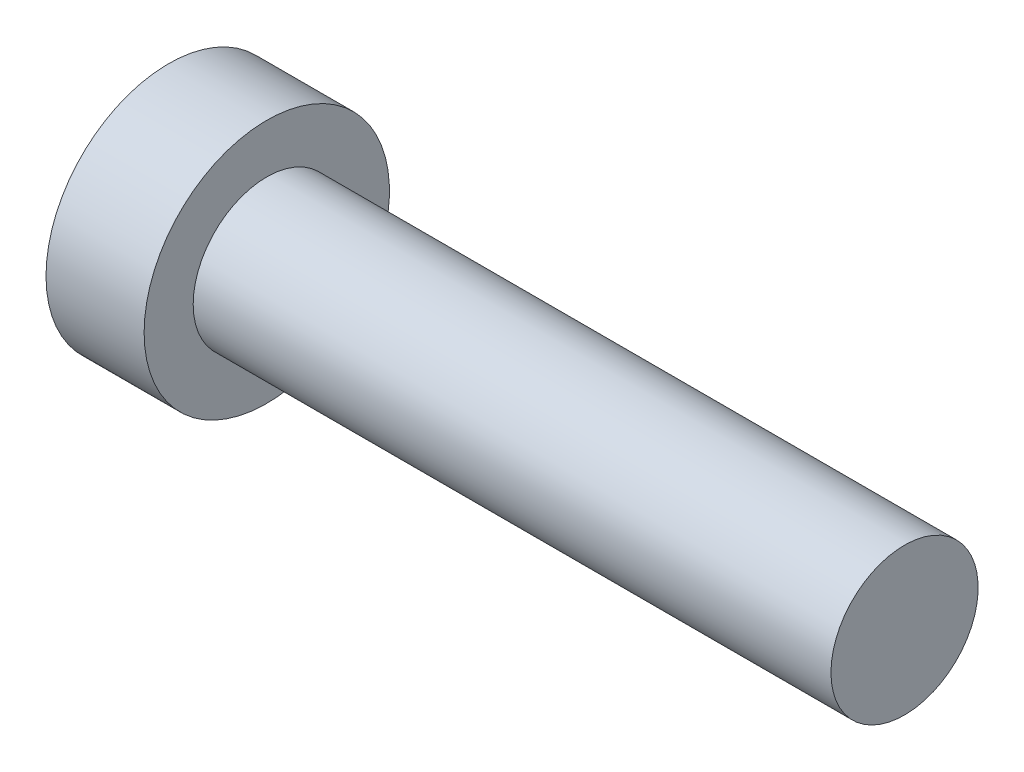
ISO-10303-21;
HEADER;
FILE_DESCRIPTION(('STEP AP214'),'2;1');
FILE_NAME('part.step','',(''),(''),'','','');
FILE_SCHEMA(('AUTOMOTIVE_DESIGN { 1 0 10303 214 1 1 1 1 }'));
ENDSEC;
DATA;
#1=APPLICATION_CONTEXT('core data for automotive mechanical design processes');
#2=APPLICATION_PROTOCOL_DEFINITION('international standard','automotive_design',2000,#1);
#3=PRODUCT_CONTEXT('',#1,'mechanical');
#4=PRODUCT('Part','Part','',(#3));
#5=PRODUCT_RELATED_PRODUCT_CATEGORY('part','',(#4));
#6=PRODUCT_DEFINITION_FORMATION('','',#4);
#7=PRODUCT_DEFINITION_CONTEXT('part definition',#1,'design');
#8=PRODUCT_DEFINITION('design','',#6,#7);
#9=PRODUCT_DEFINITION_SHAPE('','',#8);
#10=(LENGTH_UNIT() NAMED_UNIT(*) SI_UNIT(.MILLI.,.METRE.));
#11=(NAMED_UNIT(*) PLANE_ANGLE_UNIT() SI_UNIT($,.RADIAN.));
#12=(NAMED_UNIT(*) SI_UNIT($,.STERADIAN.) SOLID_ANGLE_UNIT());
#13=UNCERTAINTY_MEASURE_WITH_UNIT(LENGTH_MEASURE(1.E-05),#10,'distance_accuracy_value','');
#14=(GEOMETRIC_REPRESENTATION_CONTEXT(3) GLOBAL_UNCERTAINTY_ASSIGNED_CONTEXT((#13)) GLOBAL_UNIT_ASSIGNED_CONTEXT((#10,
#11,#12)) REPRESENTATION_CONTEXT('',''));
#15=CARTESIAN_POINT('',(0.,0.,0.));
#16=DIRECTION('',(0.,0.,1.));
#17=DIRECTION('',(1.,0.,0.));
#18=AXIS2_PLACEMENT_3D('',#15,#16,#17);
#19=CARTESIAN_POINT('',(0.,5.,0.));
#20=DIRECTION('',(1.,0.,0.));
#21=DIRECTION('',(0.,0.,-1.));
#22=AXIS2_PLACEMENT_3D('',#19,#20,#21);
#23=PLANE('',#22);
#24=DIRECTION('',(0.,0.866025403784439,-0.5));
#25=VECTOR('',#24,1.);
#26=CARTESIAN_POINT('',(0.,0.,2.88675134594813));
#27=LINE('',#26,#25);
#28=CARTESIAN_POINT('',(0.,0.,2.88675134594813));
#29=VERTEX_POINT('',#28);
#30=CARTESIAN_POINT('',(0.,2.5,1.44337567297406));
#31=VERTEX_POINT('',#30);
#32=EDGE_CURVE('E123',#29,#31,#27,.T.);
#33=ORIENTED_EDGE('',*,*,#32,.F.);
#34=DIRECTION('',(0.,0.866025403784439,0.5));
#35=VECTOR('',#34,1.);
#36=CARTESIAN_POINT('',(0.,-2.5,1.44337567297406));
#37=LINE('',#36,#35);
#38=CARTESIAN_POINT('',(0.,-2.5,1.44337567297406));
#39=VERTEX_POINT('',#38);
#40=EDGE_CURVE('E49',#39,#29,#37,.T.);
#41=ORIENTED_EDGE('',*,*,#40,.F.);
#42=DIRECTION('',(0.,0.,1.));
#43=VECTOR('',#42,1.);
#44=CARTESIAN_POINT('',(0.,-2.5,-1.44337567297406));
#45=LINE('',#44,#43);
#46=CARTESIAN_POINT('',(0.,-2.5,-1.44337567297406));
#47=VERTEX_POINT('',#46);
#48=EDGE_CURVE('E132',#47,#39,#45,.T.);
#49=ORIENTED_EDGE('',*,*,#48,.F.);
#50=DIRECTION('',(0.,-0.866025403784439,0.5));
#51=VECTOR('',#50,1.);
#52=CARTESIAN_POINT('',(0.,0.,-2.88675134594813));
#53=LINE('',#52,#51);
#54=CARTESIAN_POINT('',(0.,0.,-2.88675134594813));
#55=VERTEX_POINT('',#54);
#56=EDGE_CURVE('E130',#55,#47,#53,.T.);
#57=ORIENTED_EDGE('',*,*,#56,.F.);
#58=DIRECTION('',(0.,-0.866025403784439,-0.5));
#59=VECTOR('',#58,1.);
#60=CARTESIAN_POINT('',(0.,2.5,-1.44337567297407));
#61=LINE('',#60,#59);
#62=CARTESIAN_POINT('',(0.,2.5,-1.44337567297407));
#63=VERTEX_POINT('',#62);
#64=EDGE_CURVE('E97',#63,#55,#61,.T.);
#65=ORIENTED_EDGE('',*,*,#64,.F.);
#66=DIRECTION('',(0.,0.,-1.));
#67=VECTOR('',#66,1.);
#68=CARTESIAN_POINT('',(0.,2.5,1.44337567297406));
#69=LINE('',#68,#67);
#70=EDGE_CURVE('E126',#31,#63,#69,.T.);
#71=ORIENTED_EDGE('',*,*,#70,.F.);
#72=EDGE_LOOP('',(#33,#41,#49,#57,#65,#71));
#73=FACE_BOUND('',#72,.T.);
#74=CARTESIAN_POINT('',(0.,0.,0.));
#75=DIRECTION('',(-1.,0.,0.));
#76=DIRECTION('',(0.,0.,1.));
#77=AXIS2_PLACEMENT_3D('',#74,#75,#76);
#78=CIRCLE('',#77,5.);
#79=CARTESIAN_POINT('',(0.,0.,5.));
#80=VERTEX_POINT('',#79);
#81=EDGE_CURVE('E136',#80,#80,#78,.T.);
#82=ORIENTED_EDGE('',*,*,#81,.T.);
#83=EDGE_LOOP('',(#82));
#84=FACE_BOUND('',#83,.T.);
#85=ADVANCED_FACE('F35',(#73,#84),#23,.F.);
#86=CARTESIAN_POINT('',(30.,0.,0.));
#87=DIRECTION('',(-1.,0.,0.));
#88=DIRECTION('',(0.,0.,1.));
#89=AXIS2_PLACEMENT_3D('',#86,#87,#88);
#90=PLANE('',#89);
#91=CARTESIAN_POINT('',(30.,0.,0.));
#92=DIRECTION('',(-1.,0.,0.));
#93=DIRECTION('',(0.,0.,1.));
#94=AXIS2_PLACEMENT_3D('',#91,#92,#93);
#95=CIRCLE('',#94,3.);
#96=CARTESIAN_POINT('',(30.,0.,3.));
#97=VERTEX_POINT('',#96);
#98=EDGE_CURVE('E11',#97,#97,#95,.T.);
#99=ORIENTED_EDGE('',*,*,#98,.F.);
#100=EDGE_LOOP('',(#99));
#101=FACE_BOUND('',#100,.T.);
#102=ADVANCED_FACE('F154',(#101),#90,.F.);
#103=CARTESIAN_POINT('',(0.,0.,0.));
#104=DIRECTION('',(-1.,0.,0.));
#105=DIRECTION('',(0.,0.,1.));
#106=AXIS2_PLACEMENT_3D('',#103,#104,#105);
#107=CYLINDRICAL_SURFACE('',#106,3.);
#108=CARTESIAN_POINT('',(4.,0.,0.));
#109=DIRECTION('',(-1.,0.,0.));
#110=DIRECTION('',(0.,0.,1.));
#111=AXIS2_PLACEMENT_3D('',#108,#109,#110);
#112=CIRCLE('',#111,3.);
#113=CARTESIAN_POINT('',(4.,0.,3.));
#114=VERTEX_POINT('',#113);
#115=EDGE_CURVE('E42',#114,#114,#112,.T.);
#116=ORIENTED_EDGE('',*,*,#115,.F.);
#117=EDGE_LOOP('',(#116));
#118=FACE_BOUND('',#117,.T.);
#119=ORIENTED_EDGE('',*,*,#98,.T.);
#120=EDGE_LOOP('',(#119));
#121=FACE_BOUND('',#120,.T.);
#122=ADVANCED_FACE('F151',(#118,#121),#107,.T.);
#123=CARTESIAN_POINT('',(4.,3.,0.));
#124=DIRECTION('',(-1.,0.,0.));
#125=DIRECTION('',(0.,0.,1.));
#126=AXIS2_PLACEMENT_3D('',#123,#124,#125);
#127=PLANE('',#126);
#128=CARTESIAN_POINT('',(4.,0.,0.));
#129=DIRECTION('',(-1.,0.,0.));
#130=DIRECTION('',(0.,0.,1.));
#131=AXIS2_PLACEMENT_3D('',#128,#129,#130);
#132=CIRCLE('',#131,5.);
#133=CARTESIAN_POINT('',(4.,0.,5.));
#134=VERTEX_POINT('',#133);
#135=EDGE_CURVE('E144',#134,#134,#132,.T.);
#136=ORIENTED_EDGE('',*,*,#135,.F.);
#137=EDGE_LOOP('',(#136));
#138=FACE_BOUND('',#137,.T.);
#139=ORIENTED_EDGE('',*,*,#115,.T.);
#140=EDGE_LOOP('',(#139));
#141=FACE_BOUND('',#140,.T.);
#142=ADVANCED_FACE('F149',(#138,#141),#127,.F.);
#143=CARTESIAN_POINT('',(0.,0.,0.));
#144=DIRECTION('',(-1.,0.,0.));
#145=DIRECTION('',(0.,0.,1.));
#146=AXIS2_PLACEMENT_3D('',#143,#144,#145);
#147=CYLINDRICAL_SURFACE('',#146,5.);
#148=ORIENTED_EDGE('',*,*,#81,.F.);
#149=EDGE_LOOP('',(#148));
#150=FACE_BOUND('',#149,.T.);
#151=ORIENTED_EDGE('',*,*,#135,.T.);
#152=EDGE_LOOP('',(#151));
#153=FACE_BOUND('',#152,.T.);
#154=ADVANCED_FACE('F166',(#150,#153),#147,.T.);
#155=CARTESIAN_POINT('',(2.38,-2.5,1.44337567297406));
#156=DIRECTION('',(0.,-0.5,0.866025403784439));
#157=DIRECTION('',(0.,-0.866025403784439,-0.5));
#158=AXIS2_PLACEMENT_3D('',#155,#156,#157);
#159=PLANE('',#158);
#160=ORIENTED_EDGE('',*,*,#40,.T.);
#161=DIRECTION('',(-1.,0.,0.));
#162=VECTOR('',#161,1.);
#163=CARTESIAN_POINT('',(2.38,0.,2.88675134594813));
#164=LINE('',#163,#162);
#165=CARTESIAN_POINT('',(2.38,0.,2.88675134594813));
#166=VERTEX_POINT('',#165);
#167=EDGE_CURVE('E79',#166,#29,#164,.T.);
#168=ORIENTED_EDGE('',*,*,#167,.F.);
#169=DIRECTION('',(0.,0.866025403784439,0.5));
#170=VECTOR('',#169,1.);
#171=CARTESIAN_POINT('',(2.38,-2.5,1.44337567297406));
#172=LINE('',#171,#170);
#173=CARTESIAN_POINT('',(2.38,-2.5,1.44337567297406));
#174=VERTEX_POINT('',#173);
#175=EDGE_CURVE('E134',#174,#166,#172,.T.);
#176=ORIENTED_EDGE('',*,*,#175,.F.);
#177=DIRECTION('',(-1.,0.,0.));
#178=VECTOR('',#177,1.);
#179=CARTESIAN_POINT('',(2.38,-2.5,1.44337567297406));
#180=LINE('',#179,#178);
#181=EDGE_CURVE('E57',#174,#39,#180,.T.);
#182=ORIENTED_EDGE('',*,*,#181,.T.);
#183=EDGE_LOOP('',(#160,#168,#176,#182));
#184=FACE_BOUND('',#183,.T.);
#185=ADVANCED_FACE('F170',(#184),#159,.F.);
#186=CARTESIAN_POINT('',(2.38,-2.5,-1.44337567297406));
#187=DIRECTION('',(0.,-1.,0.));
#188=DIRECTION('',(0.,0.,-1.));
#189=AXIS2_PLACEMENT_3D('',#186,#187,#188);
#190=PLANE('',#189);
#191=ORIENTED_EDGE('',*,*,#48,.T.);
#192=ORIENTED_EDGE('',*,*,#181,.F.);
#193=DIRECTION('',(0.,0.,1.));
#194=VECTOR('',#193,1.);
#195=CARTESIAN_POINT('',(2.38,-2.5,-1.44337567297406));
#196=LINE('',#195,#194);
#197=CARTESIAN_POINT('',(2.38,-2.5,-1.44337567297406));
#198=VERTEX_POINT('',#197);
#199=EDGE_CURVE('E109',#198,#174,#196,.T.);
#200=ORIENTED_EDGE('',*,*,#199,.F.);
#201=DIRECTION('',(-1.,0.,0.));
#202=VECTOR('',#201,1.);
#203=CARTESIAN_POINT('',(2.38,-2.5,-1.44337567297406));
#204=LINE('',#203,#202);
#205=EDGE_CURVE('E101',#198,#47,#204,.T.);
#206=ORIENTED_EDGE('',*,*,#205,.T.);
#207=EDGE_LOOP('',(#191,#192,#200,#206));
#208=FACE_BOUND('',#207,.T.);
#209=ADVANCED_FACE('F174',(#208),#190,.F.);
#210=CARTESIAN_POINT('',(2.38,0.,-2.88675134594813));
#211=DIRECTION('',(0.,-0.5,-0.866025403784438));
#212=DIRECTION('',(0.,0.866025403784439,-0.5));
#213=AXIS2_PLACEMENT_3D('',#210,#211,#212);
#214=PLANE('',#213);
#215=ORIENTED_EDGE('',*,*,#56,.T.);
#216=ORIENTED_EDGE('',*,*,#205,.F.);
#217=DIRECTION('',(0.,-0.866025403784439,0.5));
#218=VECTOR('',#217,1.);
#219=CARTESIAN_POINT('',(2.38,0.,-2.88675134594813));
#220=LINE('',#219,#218);
#221=CARTESIAN_POINT('',(2.38,0.,-2.88675134594813));
#222=VERTEX_POINT('',#221);
#223=EDGE_CURVE('E105',#222,#198,#220,.T.);
#224=ORIENTED_EDGE('',*,*,#223,.F.);
#225=DIRECTION('',(-1.,0.,0.));
#226=VECTOR('',#225,1.);
#227=CARTESIAN_POINT('',(2.38,0.,-2.88675134594813));
#228=LINE('',#227,#226);
#229=EDGE_CURVE('E90',#222,#55,#228,.T.);
#230=ORIENTED_EDGE('',*,*,#229,.T.);
#231=EDGE_LOOP('',(#215,#216,#224,#230));
#232=FACE_BOUND('',#231,.T.);
#233=ADVANCED_FACE('F106',(#232),#214,.F.);
#234=CARTESIAN_POINT('',(2.38,2.5,-1.44337567297407));
#235=DIRECTION('',(0.,0.5,-0.866025403784439));
#236=DIRECTION('',(0.,0.866025403784439,0.5));
#237=AXIS2_PLACEMENT_3D('',#234,#235,#236);
#238=PLANE('',#237);
#239=ORIENTED_EDGE('',*,*,#64,.T.);
#240=ORIENTED_EDGE('',*,*,#229,.F.);
#241=DIRECTION('',(0.,-0.866025403784439,-0.5));
#242=VECTOR('',#241,1.);
#243=CARTESIAN_POINT('',(2.38,2.5,-1.44337567297407));
#244=LINE('',#243,#242);
#245=CARTESIAN_POINT('',(2.38,2.5,-1.44337567297407));
#246=VERTEX_POINT('',#245);
#247=EDGE_CURVE('E94',#246,#222,#244,.T.);
#248=ORIENTED_EDGE('',*,*,#247,.F.);
#249=DIRECTION('',(-1.,0.,0.));
#250=VECTOR('',#249,1.);
#251=CARTESIAN_POINT('',(2.38,2.5,-1.44337567297407));
#252=LINE('',#251,#250);
#253=EDGE_CURVE('E102',#246,#63,#252,.T.);
#254=ORIENTED_EDGE('',*,*,#253,.T.);
#255=EDGE_LOOP('',(#239,#240,#248,#254));
#256=FACE_BOUND('',#255,.T.);
#257=ADVANCED_FACE('F92',(#256),#238,.F.);
#258=CARTESIAN_POINT('',(2.38,2.5,1.44337567297406));
#259=DIRECTION('',(0.,1.,0.));
#260=DIRECTION('',(0.,0.,1.));
#261=AXIS2_PLACEMENT_3D('',#258,#259,#260);
#262=PLANE('',#261);
#263=ORIENTED_EDGE('',*,*,#70,.T.);
#264=ORIENTED_EDGE('',*,*,#253,.F.);
#265=DIRECTION('',(0.,0.,-1.));
#266=VECTOR('',#265,1.);
#267=CARTESIAN_POINT('',(2.38,2.5,1.44337567297406));
#268=LINE('',#267,#266);
#269=CARTESIAN_POINT('',(2.38,2.5,1.44337567297406));
#270=VERTEX_POINT('',#269);
#271=EDGE_CURVE('E115',#270,#246,#268,.T.);
#272=ORIENTED_EDGE('',*,*,#271,.F.);
#273=DIRECTION('',(-1.,0.,0.));
#274=VECTOR('',#273,1.);
#275=CARTESIAN_POINT('',(2.38,2.5,1.44337567297406));
#276=LINE('',#275,#274);
#277=EDGE_CURVE('E139',#270,#31,#276,.T.);
#278=ORIENTED_EDGE('',*,*,#277,.T.);
#279=EDGE_LOOP('',(#263,#264,#272,#278));
#280=FACE_BOUND('',#279,.T.);
#281=ADVANCED_FACE('F178',(#280),#262,.F.);
#282=CARTESIAN_POINT('',(2.38,0.,2.88675134594813));
#283=DIRECTION('',(0.,0.5,0.866025403784438));
#284=DIRECTION('',(0.,-0.866025403784439,0.5));
#285=AXIS2_PLACEMENT_3D('',#282,#283,#284);
#286=PLANE('',#285);
#287=ORIENTED_EDGE('',*,*,#32,.T.);
#288=ORIENTED_EDGE('',*,*,#277,.F.);
#289=DIRECTION('',(0.,0.866025403784439,-0.5));
#290=VECTOR('',#289,1.);
#291=CARTESIAN_POINT('',(2.38,0.,2.88675134594813));
#292=LINE('',#291,#290);
#293=EDGE_CURVE('E117',#166,#270,#292,.T.);
#294=ORIENTED_EDGE('',*,*,#293,.F.);
#295=ORIENTED_EDGE('',*,*,#167,.T.);
#296=EDGE_LOOP('',(#287,#288,#294,#295));
#297=FACE_BOUND('',#296,.T.);
#298=ADVANCED_FACE('F175',(#297),#286,.F.);
#299=CARTESIAN_POINT('',(2.38,0.,2.88675134594813));
#300=DIRECTION('',(-1.,0.,0.));
#301=DIRECTION('',(0.,0.,1.));
#302=AXIS2_PLACEMENT_3D('',#299,#300,#301);
#303=PLANE('',#302);
#304=ORIENTED_EDGE('',*,*,#175,.T.);
#305=ORIENTED_EDGE('',*,*,#293,.T.);
#306=ORIENTED_EDGE('',*,*,#271,.T.);
#307=ORIENTED_EDGE('',*,*,#247,.T.);
#308=ORIENTED_EDGE('',*,*,#223,.T.);
#309=ORIENTED_EDGE('',*,*,#199,.T.);
#310=EDGE_LOOP('',(#304,#305,#306,#307,#308,#309));
#311=FACE_BOUND('',#310,.T.);
#312=ADVANCED_FACE('F112',(#311),#303,.T.);
#313=CLOSED_SHELL('',(#85,#102,#122,#142,#154,#185,#209,#233,#257,#281,#298,#312));
#314=MANIFOLD_SOLID_BREP('B2',#313);
#315=ADVANCED_BREP_SHAPE_REPRESENTATION('',(#18,#314),#14);
#316=SHAPE_DEFINITION_REPRESENTATION(#9,#315);
ENDSEC;
END-ISO-10303-21;
